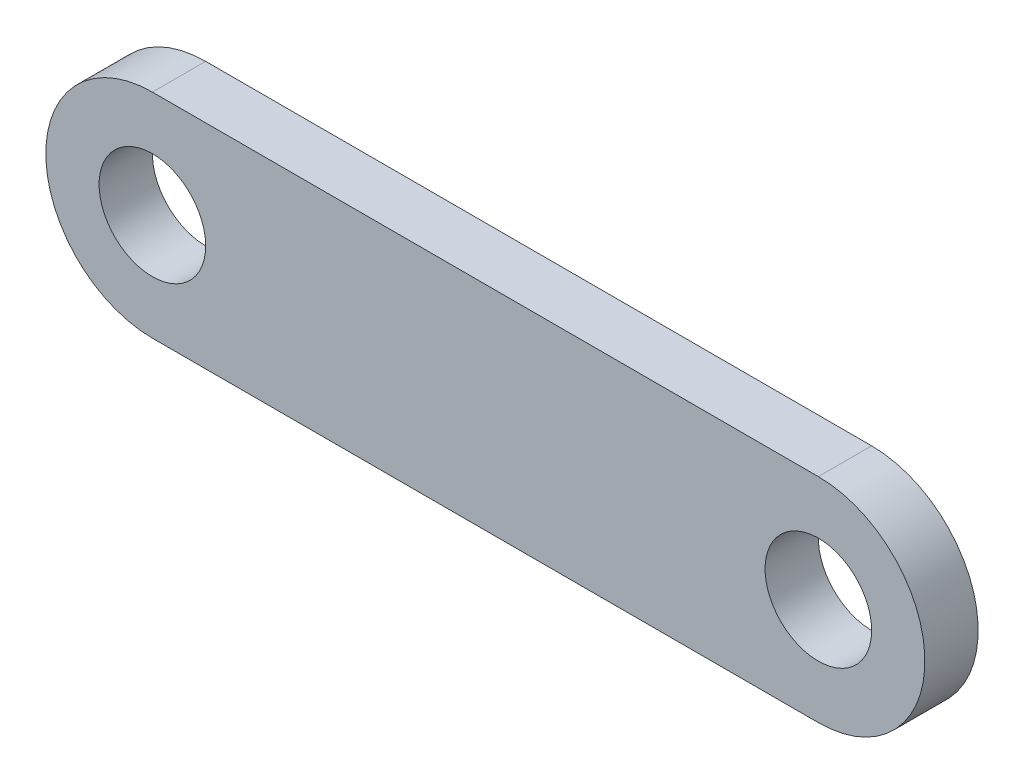
ISO-10303-21;
HEADER;
FILE_DESCRIPTION(('STEP AP214'),'2;1');
FILE_NAME('part.step','',(''),(''),'','','');
FILE_SCHEMA(('AUTOMOTIVE_DESIGN { 1 0 10303 214 1 1 1 1 }'));
ENDSEC;
DATA;
#1=APPLICATION_CONTEXT('core data for automotive mechanical design processes');
#2=APPLICATION_PROTOCOL_DEFINITION('international standard','automotive_design',2000,#1);
#3=PRODUCT_CONTEXT('',#1,'mechanical');
#4=PRODUCT('Part','Part','',(#3));
#5=PRODUCT_RELATED_PRODUCT_CATEGORY('part','',(#4));
#6=PRODUCT_DEFINITION_FORMATION('','',#4);
#7=PRODUCT_DEFINITION_CONTEXT('part definition',#1,'design');
#8=PRODUCT_DEFINITION('design','',#6,#7);
#9=PRODUCT_DEFINITION_SHAPE('','',#8);
#10=(LENGTH_UNIT() NAMED_UNIT(*) SI_UNIT(.MILLI.,.METRE.));
#11=(NAMED_UNIT(*) PLANE_ANGLE_UNIT() SI_UNIT($,.RADIAN.));
#12=(NAMED_UNIT(*) SI_UNIT($,.STERADIAN.) SOLID_ANGLE_UNIT());
#13=UNCERTAINTY_MEASURE_WITH_UNIT(LENGTH_MEASURE(1.E-05),#10,'distance_accuracy_value','');
#14=(GEOMETRIC_REPRESENTATION_CONTEXT(3) GLOBAL_UNCERTAINTY_ASSIGNED_CONTEXT((#13)) GLOBAL_UNIT_ASSIGNED_CONTEXT((#10,
#11,#12)) REPRESENTATION_CONTEXT('',''));
#15=CARTESIAN_POINT('',(0.,0.,0.));
#16=DIRECTION('',(0.,0.,1.));
#17=DIRECTION('',(1.,0.,0.));
#18=AXIS2_PLACEMENT_3D('',#15,#16,#17);
#19=CARTESIAN_POINT('',(0.,0.,2.));
#20=DIRECTION('',(0.,0.,1.));
#21=DIRECTION('',(1.,0.,0.));
#22=AXIS2_PLACEMENT_3D('',#19,#20,#21);
#23=PLANE('',#22);
#24=CARTESIAN_POINT('',(0.,0.,2.));
#25=DIRECTION('',(0.,0.,1.));
#26=DIRECTION('',(1.,0.,0.));
#27=AXIS2_PLACEMENT_3D('',#24,#25,#26);
#28=CIRCLE('',#27,2.);
#29=CARTESIAN_POINT('',(2.,0.,2.));
#30=VERTEX_POINT('',#29);
#31=EDGE_CURVE('E106',#30,#30,#28,.T.);
#32=ORIENTED_EDGE('',*,*,#31,.F.);
#33=EDGE_LOOP('',(#32));
#34=FACE_BOUND('',#33,.T.);
#35=CARTESIAN_POINT('',(0.,0.,2.));
#36=DIRECTION('',(0.,0.,1.));
#37=DIRECTION('',(1.,0.,0.));
#38=AXIS2_PLACEMENT_3D('',#35,#36,#37);
#39=CIRCLE('',#38,4.);
#40=CARTESIAN_POINT('',(0.,4.,2.));
#41=VERTEX_POINT('',#40);
#42=CARTESIAN_POINT('',(0.,-4.,2.));
#43=VERTEX_POINT('',#42);
#44=EDGE_CURVE('E91',#41,#43,#39,.T.);
#45=ORIENTED_EDGE('',*,*,#44,.T.);
#46=DIRECTION('',(1.,0.,0.));
#47=VECTOR('',#46,1.);
#48=CARTESIAN_POINT('',(0.,-4.,2.));
#49=LINE('',#48,#47);
#50=CARTESIAN_POINT('',(25.,-4.,2.));
#51=VERTEX_POINT('',#50);
#52=EDGE_CURVE('E86',#43,#51,#49,.T.);
#53=ORIENTED_EDGE('',*,*,#52,.T.);
#54=CARTESIAN_POINT('',(25.,0.,2.));
#55=DIRECTION('',(0.,0.,1.));
#56=DIRECTION('',(1.,0.,0.));
#57=AXIS2_PLACEMENT_3D('',#54,#55,#56);
#58=CIRCLE('',#57,4.);
#59=CARTESIAN_POINT('',(25.,4.,2.));
#60=VERTEX_POINT('',#59);
#61=EDGE_CURVE('E89',#51,#60,#58,.T.);
#62=ORIENTED_EDGE('',*,*,#61,.T.);
#63=DIRECTION('',(-1.,0.,0.));
#64=VECTOR('',#63,1.);
#65=CARTESIAN_POINT('',(0.,4.,2.));
#66=LINE('',#65,#64);
#67=EDGE_CURVE('E56',#60,#41,#66,.T.);
#68=ORIENTED_EDGE('',*,*,#67,.T.);
#69=EDGE_LOOP('',(#45,#53,#62,#68));
#70=FACE_BOUND('',#69,.T.);
#71=CARTESIAN_POINT('',(25.,0.,2.));
#72=DIRECTION('',(0.,0.,1.));
#73=DIRECTION('',(1.,0.,0.));
#74=AXIS2_PLACEMENT_3D('',#71,#72,#73);
#75=CIRCLE('',#74,2.);
#76=CARTESIAN_POINT('',(27.,0.,2.));
#77=VERTEX_POINT('',#76);
#78=EDGE_CURVE('E121',#77,#77,#75,.T.);
#79=ORIENTED_EDGE('',*,*,#78,.F.);
#80=EDGE_LOOP('',(#79));
#81=FACE_BOUND('',#80,.T.);
#82=ADVANCED_FACE('F39',(#34,#70,#81),#23,.T.);
#83=CARTESIAN_POINT('',(0.,0.,0.));
#84=DIRECTION('',(0.,0.,1.));
#85=DIRECTION('',(1.,0.,0.));
#86=AXIS2_PLACEMENT_3D('',#83,#84,#85);
#87=PLANE('',#86);
#88=CARTESIAN_POINT('',(0.,0.,0.));
#89=DIRECTION('',(0.,0.,1.));
#90=DIRECTION('',(1.,0.,0.));
#91=AXIS2_PLACEMENT_3D('',#88,#89,#90);
#92=CIRCLE('',#91,4.);
#93=CARTESIAN_POINT('',(0.,4.,0.));
#94=VERTEX_POINT('',#93);
#95=CARTESIAN_POINT('',(0.,-4.,0.));
#96=VERTEX_POINT('',#95);
#97=EDGE_CURVE('E103',#94,#96,#92,.T.);
#98=ORIENTED_EDGE('',*,*,#97,.F.);
#99=DIRECTION('',(-1.,0.,0.));
#100=VECTOR('',#99,1.);
#101=CARTESIAN_POINT('',(0.,4.,0.));
#102=LINE('',#101,#100);
#103=CARTESIAN_POINT('',(25.,4.,0.));
#104=VERTEX_POINT('',#103);
#105=EDGE_CURVE('E79',#104,#94,#102,.T.);
#106=ORIENTED_EDGE('',*,*,#105,.F.);
#107=CARTESIAN_POINT('',(25.,0.,0.));
#108=DIRECTION('',(0.,0.,1.));
#109=DIRECTION('',(1.,0.,0.));
#110=AXIS2_PLACEMENT_3D('',#107,#108,#109);
#111=CIRCLE('',#110,4.);
#112=CARTESIAN_POINT('',(25.,-4.,0.));
#113=VERTEX_POINT('',#112);
#114=EDGE_CURVE('E73',#113,#104,#111,.T.);
#115=ORIENTED_EDGE('',*,*,#114,.F.);
#116=DIRECTION('',(1.,0.,0.));
#117=VECTOR('',#116,1.);
#118=CARTESIAN_POINT('',(0.,-4.,0.));
#119=LINE('',#118,#117);
#120=EDGE_CURVE('E95',#96,#113,#119,.T.);
#121=ORIENTED_EDGE('',*,*,#120,.F.);
#122=EDGE_LOOP('',(#98,#106,#115,#121));
#123=FACE_BOUND('',#122,.T.);
#124=CARTESIAN_POINT('',(0.,0.,0.));
#125=DIRECTION('',(0.,0.,1.));
#126=DIRECTION('',(1.,0.,0.));
#127=AXIS2_PLACEMENT_3D('',#124,#125,#126);
#128=CIRCLE('',#127,2.);
#129=CARTESIAN_POINT('',(2.,0.,0.));
#130=VERTEX_POINT('',#129);
#131=EDGE_CURVE('E118',#130,#130,#128,.T.);
#132=ORIENTED_EDGE('',*,*,#131,.T.);
#133=EDGE_LOOP('',(#132));
#134=FACE_BOUND('',#133,.T.);
#135=CARTESIAN_POINT('',(25.,0.,0.));
#136=DIRECTION('',(0.,0.,1.));
#137=DIRECTION('',(1.,0.,0.));
#138=AXIS2_PLACEMENT_3D('',#135,#136,#137);
#139=CIRCLE('',#138,2.);
#140=CARTESIAN_POINT('',(27.,0.,0.));
#141=VERTEX_POINT('',#140);
#142=EDGE_CURVE('E124',#141,#141,#139,.T.);
#143=ORIENTED_EDGE('',*,*,#142,.T.);
#144=EDGE_LOOP('',(#143));
#145=FACE_BOUND('',#144,.T.);
#146=ADVANCED_FACE('F114',(#123,#134,#145),#87,.F.);
#147=CARTESIAN_POINT('',(0.,0.,2.));
#148=DIRECTION('',(0.,0.,-1.));
#149=DIRECTION('',(-1.,0.,0.));
#150=AXIS2_PLACEMENT_3D('',#147,#148,#149);
#151=CYLINDRICAL_SURFACE('',#150,4.);
#152=ORIENTED_EDGE('',*,*,#97,.T.);
#153=DIRECTION('',(0.,0.,-1.));
#154=VECTOR('',#153,1.);
#155=CARTESIAN_POINT('',(0.,-4.,2.));
#156=LINE('',#155,#154);
#157=EDGE_CURVE('E11',#43,#96,#156,.T.);
#158=ORIENTED_EDGE('',*,*,#157,.F.);
#159=ORIENTED_EDGE('',*,*,#44,.F.);
#160=DIRECTION('',(0.,0.,-1.));
#161=VECTOR('',#160,1.);
#162=CARTESIAN_POINT('',(0.,4.,2.));
#163=LINE('',#162,#161);
#164=EDGE_CURVE('E99',#41,#94,#163,.T.);
#165=ORIENTED_EDGE('',*,*,#164,.T.);
#166=EDGE_LOOP('',(#152,#158,#159,#165));
#167=FACE_BOUND('',#166,.T.);
#168=ADVANCED_FACE('F41',(#167),#151,.T.);
#169=CARTESIAN_POINT('',(0.,-4.,2.));
#170=DIRECTION('',(0.,1.,0.));
#171=DIRECTION('',(0.,0.,1.));
#172=AXIS2_PLACEMENT_3D('',#169,#170,#171);
#173=PLANE('',#172);
#174=ORIENTED_EDGE('',*,*,#120,.T.);
#175=DIRECTION('',(0.,0.,-1.));
#176=VECTOR('',#175,1.);
#177=CARTESIAN_POINT('',(25.,-4.,2.));
#178=LINE('',#177,#176);
#179=EDGE_CURVE('E48',#51,#113,#178,.T.);
#180=ORIENTED_EDGE('',*,*,#179,.F.);
#181=ORIENTED_EDGE('',*,*,#52,.F.);
#182=ORIENTED_EDGE('',*,*,#157,.T.);
#183=EDGE_LOOP('',(#174,#180,#181,#182));
#184=FACE_BOUND('',#183,.T.);
#185=ADVANCED_FACE('F94',(#184),#173,.F.);
#186=CARTESIAN_POINT('',(25.,0.,2.));
#187=DIRECTION('',(0.,0.,-1.));
#188=DIRECTION('',(-1.,0.,0.));
#189=AXIS2_PLACEMENT_3D('',#186,#187,#188);
#190=CYLINDRICAL_SURFACE('',#189,4.);
#191=ORIENTED_EDGE('',*,*,#114,.T.);
#192=DIRECTION('',(0.,0.,-1.));
#193=VECTOR('',#192,1.);
#194=CARTESIAN_POINT('',(25.,4.,2.));
#195=LINE('',#194,#193);
#196=EDGE_CURVE('E96',#60,#104,#195,.T.);
#197=ORIENTED_EDGE('',*,*,#196,.F.);
#198=ORIENTED_EDGE('',*,*,#61,.F.);
#199=ORIENTED_EDGE('',*,*,#179,.T.);
#200=EDGE_LOOP('',(#191,#197,#198,#199));
#201=FACE_BOUND('',#200,.T.);
#202=ADVANCED_FACE('F97',(#201),#190,.T.);
#203=CARTESIAN_POINT('',(0.,4.,2.));
#204=DIRECTION('',(0.,-1.,0.));
#205=DIRECTION('',(0.,0.,-1.));
#206=AXIS2_PLACEMENT_3D('',#203,#204,#205);
#207=PLANE('',#206);
#208=ORIENTED_EDGE('',*,*,#105,.T.);
#209=ORIENTED_EDGE('',*,*,#164,.F.);
#210=ORIENTED_EDGE('',*,*,#67,.F.);
#211=ORIENTED_EDGE('',*,*,#196,.T.);
#212=EDGE_LOOP('',(#208,#209,#210,#211));
#213=FACE_BOUND('',#212,.T.);
#214=ADVANCED_FACE('F111',(#213),#207,.F.);
#215=CARTESIAN_POINT('',(0.,0.,2.));
#216=DIRECTION('',(0.,0.,-1.));
#217=DIRECTION('',(-1.,0.,0.));
#218=AXIS2_PLACEMENT_3D('',#215,#216,#217);
#219=CYLINDRICAL_SURFACE('',#218,2.);
#220=ORIENTED_EDGE('',*,*,#31,.T.);
#221=EDGE_LOOP('',(#220));
#222=FACE_BOUND('',#221,.T.);
#223=ORIENTED_EDGE('',*,*,#131,.F.);
#224=EDGE_LOOP('',(#223));
#225=FACE_BOUND('',#224,.T.);
#226=ADVANCED_FACE('F141',(#222,#225),#219,.F.);
#227=CARTESIAN_POINT('',(25.,0.,2.));
#228=DIRECTION('',(0.,0.,-1.));
#229=DIRECTION('',(-1.,0.,0.));
#230=AXIS2_PLACEMENT_3D('',#227,#228,#229);
#231=CYLINDRICAL_SURFACE('',#230,2.);
#232=ORIENTED_EDGE('',*,*,#78,.T.);
#233=EDGE_LOOP('',(#232));
#234=FACE_BOUND('',#233,.T.);
#235=ORIENTED_EDGE('',*,*,#142,.F.);
#236=EDGE_LOOP('',(#235));
#237=FACE_BOUND('',#236,.T.);
#238=ADVANCED_FACE('F130',(#234,#237),#231,.F.);
#239=CLOSED_SHELL('',(#82,#146,#168,#185,#202,#214,#226,#238));
#240=MANIFOLD_SOLID_BREP('B2',#239);
#241=ADVANCED_BREP_SHAPE_REPRESENTATION('',(#18,#240),#14);
#242=SHAPE_DEFINITION_REPRESENTATION(#9,#241);
ENDSEC;
END-ISO-10303-21;
